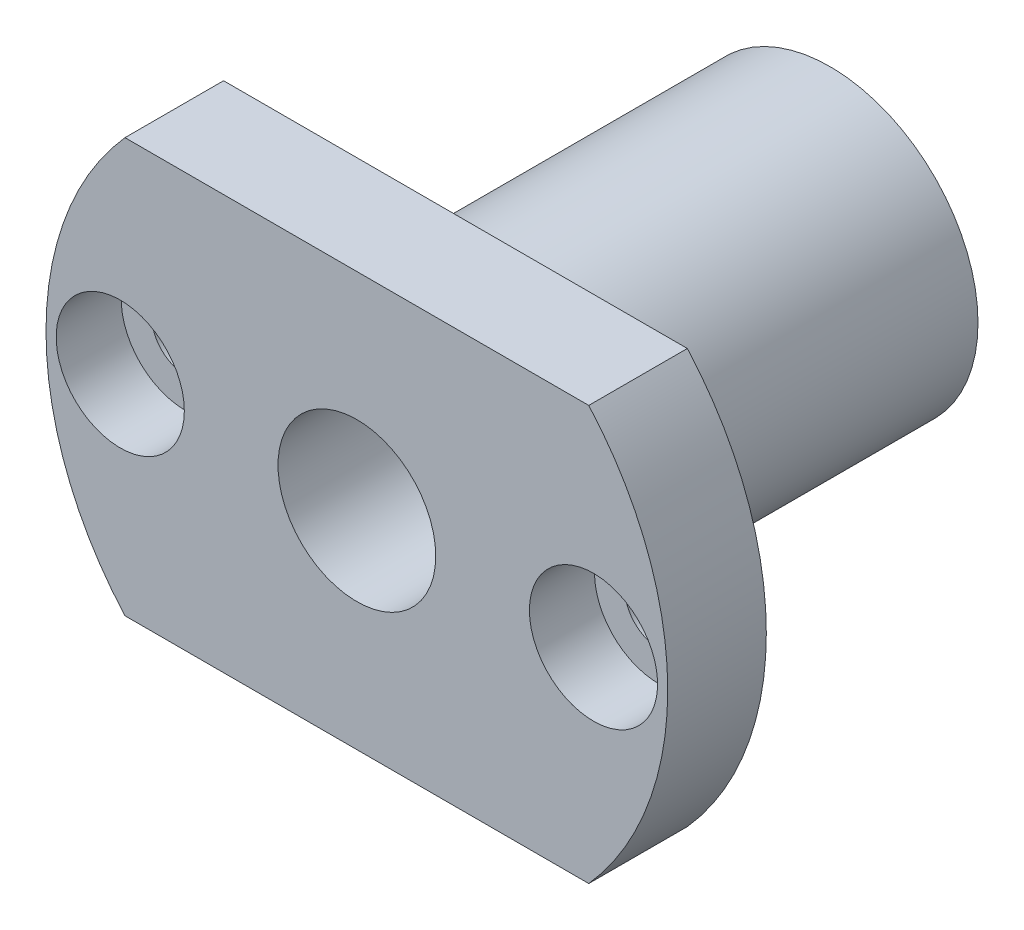
ISO-10303-21;
HEADER;
FILE_DESCRIPTION(('STEP AP214'),'2;1');
FILE_NAME('part.step','',(''),(''),'','','');
FILE_SCHEMA(('AUTOMOTIVE_DESIGN { 1 0 10303 214 1 1 1 1 }'));
ENDSEC;
DATA;
#1=APPLICATION_CONTEXT('core data for automotive mechanical design processes');
#2=APPLICATION_PROTOCOL_DEFINITION('international standard','automotive_design',2000,#1);
#3=PRODUCT_CONTEXT('',#1,'mechanical');
#4=PRODUCT('Part','Part','',(#3));
#5=PRODUCT_RELATED_PRODUCT_CATEGORY('part','',(#4));
#6=PRODUCT_DEFINITION_FORMATION('','',#4);
#7=PRODUCT_DEFINITION_CONTEXT('part definition',#1,'design');
#8=PRODUCT_DEFINITION('design','',#6,#7);
#9=PRODUCT_DEFINITION_SHAPE('','',#8);
#10=(LENGTH_UNIT() NAMED_UNIT(*) SI_UNIT(.MILLI.,.METRE.));
#11=(NAMED_UNIT(*) PLANE_ANGLE_UNIT() SI_UNIT($,.RADIAN.));
#12=(NAMED_UNIT(*) SI_UNIT($,.STERADIAN.) SOLID_ANGLE_UNIT());
#13=UNCERTAINTY_MEASURE_WITH_UNIT(LENGTH_MEASURE(1.E-05),#10,'distance_accuracy_value','');
#14=(GEOMETRIC_REPRESENTATION_CONTEXT(3) GLOBAL_UNCERTAINTY_ASSIGNED_CONTEXT((#13)) GLOBAL_UNIT_ASSIGNED_CONTEXT((#10,
#11,#12)) REPRESENTATION_CONTEXT('',''));
#15=CARTESIAN_POINT('',(0.,0.,0.));
#16=DIRECTION('',(0.,0.,1.));
#17=DIRECTION('',(1.,0.,0.));
#18=AXIS2_PLACEMENT_3D('',#15,#16,#17);
#19=CARTESIAN_POINT('',(-12.,0.,5.));
#20=DIRECTION('',(0.,0.,-1.));
#21=DIRECTION('',(-1.,0.,0.));
#22=AXIS2_PLACEMENT_3D('',#19,#20,#21);
#23=CYLINDRICAL_SURFACE('',#22,1.7);
#24=CARTESIAN_POINT('',(-12.,0.,0.));
#25=DIRECTION('',(0.,0.,1.));
#26=DIRECTION('',(1.,0.,0.));
#27=AXIS2_PLACEMENT_3D('',#24,#25,#26);
#28=CIRCLE('',#27,1.7);
#29=CARTESIAN_POINT('',(-10.3,0.,0.));
#30=VERTEX_POINT('',#29);
#31=EDGE_CURVE('E117',#30,#30,#28,.T.);
#32=ORIENTED_EDGE('',*,*,#31,.F.);
#33=EDGE_LOOP('',(#32));
#34=FACE_BOUND('',#33,.T.);
#35=CARTESIAN_POINT('',(-12.,0.,1.7));
#36=DIRECTION('',(0.,0.,1.));
#37=DIRECTION('',(1.,0.,0.));
#38=AXIS2_PLACEMENT_3D('',#35,#36,#37);
#39=CIRCLE('',#38,1.7);
#40=CARTESIAN_POINT('',(-10.3,0.,1.7));
#41=VERTEX_POINT('',#40);
#42=EDGE_CURVE('E124',#41,#41,#39,.T.);
#43=ORIENTED_EDGE('',*,*,#42,.T.);
#44=EDGE_LOOP('',(#43));
#45=FACE_BOUND('',#44,.T.);
#46=ADVANCED_FACE('F39',(#34,#45),#23,.F.);
#47=CARTESIAN_POINT('',(0.,-10.5,5.));
#48=DIRECTION('',(0.,1.,0.));
#49=DIRECTION('',(-1.,0.,0.));
#50=AXIS2_PLACEMENT_3D('',#47,#48,#49);
#51=PLANE('',#50);
#52=DIRECTION('',(1.,0.,0.));
#53=VECTOR('',#52,1.);
#54=CARTESIAN_POINT('',(0.,-10.5,0.));
#55=LINE('',#54,#53);
#56=CARTESIAN_POINT('',(-11.7600786208239,-10.5,0.));
#57=VERTEX_POINT('',#56);
#58=CARTESIAN_POINT('',(11.7600786208239,-10.5,0.));
#59=VERTEX_POINT('',#58);
#60=EDGE_CURVE('E109',#57,#59,#55,.T.);
#61=ORIENTED_EDGE('',*,*,#60,.T.);
#62=DIRECTION('',(0.,0.,-1.));
#63=VECTOR('',#62,1.);
#64=CARTESIAN_POINT('',(11.7600786208239,-10.5,5.));
#65=LINE('',#64,#63);
#66=CARTESIAN_POINT('',(11.7600786208239,-10.5,5.));
#67=VERTEX_POINT('',#66);
#68=EDGE_CURVE('E11',#67,#59,#65,.T.);
#69=ORIENTED_EDGE('',*,*,#68,.F.);
#70=DIRECTION('',(1.,0.,0.));
#71=VECTOR('',#70,1.);
#72=CARTESIAN_POINT('',(0.,-10.5,5.));
#73=LINE('',#72,#71);
#74=CARTESIAN_POINT('',(-11.7600786208239,-10.5,5.));
#75=VERTEX_POINT('',#74);
#76=EDGE_CURVE('E90',#75,#67,#73,.T.);
#77=ORIENTED_EDGE('',*,*,#76,.F.);
#78=DIRECTION('',(0.,0.,-1.));
#79=VECTOR('',#78,1.);
#80=CARTESIAN_POINT('',(-11.7600786208239,-10.5,5.));
#81=LINE('',#80,#79);
#82=EDGE_CURVE('E108',#75,#57,#81,.T.);
#83=ORIENTED_EDGE('',*,*,#82,.T.);
#84=EDGE_LOOP('',(#61,#69,#77,#83));
#85=FACE_BOUND('',#84,.T.);
#86=ADVANCED_FACE('F41',(#85),#51,.F.);
#87=CARTESIAN_POINT('',(0.,0.,5.));
#88=DIRECTION('',(0.,0.,-1.));
#89=DIRECTION('',(-1.,0.,0.));
#90=AXIS2_PLACEMENT_3D('',#87,#88,#89);
#91=CYLINDRICAL_SURFACE('',#90,15.7654511247842);
#92=CARTESIAN_POINT('',(0.,0.,0.));
#93=DIRECTION('',(0.,0.,1.));
#94=DIRECTION('',(1.,0.,0.));
#95=AXIS2_PLACEMENT_3D('',#92,#93,#94);
#96=CIRCLE('',#95,15.7654511247842);
#97=CARTESIAN_POINT('',(11.7600786208239,10.5,0.));
#98=VERTEX_POINT('',#97);
#99=EDGE_CURVE('E95',#59,#98,#96,.T.);
#100=ORIENTED_EDGE('',*,*,#99,.T.);
#101=DIRECTION('',(0.,0.,-1.));
#102=VECTOR('',#101,1.);
#103=CARTESIAN_POINT('',(11.7600786208239,10.5,5.));
#104=LINE('',#103,#102);
#105=CARTESIAN_POINT('',(11.7600786208239,10.5,5.));
#106=VERTEX_POINT('',#105);
#107=EDGE_CURVE('E49',#106,#98,#104,.T.);
#108=ORIENTED_EDGE('',*,*,#107,.F.);
#109=CARTESIAN_POINT('',(0.,0.,5.));
#110=DIRECTION('',(0.,0.,1.));
#111=DIRECTION('',(1.,0.,0.));
#112=AXIS2_PLACEMENT_3D('',#109,#110,#111);
#113=CIRCLE('',#112,15.7654511247842);
#114=EDGE_CURVE('E84',#67,#106,#113,.T.);
#115=ORIENTED_EDGE('',*,*,#114,.F.);
#116=ORIENTED_EDGE('',*,*,#68,.T.);
#117=EDGE_LOOP('',(#100,#108,#115,#116));
#118=FACE_BOUND('',#117,.T.);
#119=ADVANCED_FACE('F94',(#118),#91,.T.);
#120=CARTESIAN_POINT('',(0.,10.5,5.));
#121=DIRECTION('',(0.,1.,0.));
#122=DIRECTION('',(0.,0.,1.));
#123=AXIS2_PLACEMENT_3D('',#120,#121,#122);
#124=PLANE('',#123);
#125=DIRECTION('',(1.,0.,0.));
#126=VECTOR('',#125,1.);
#127=CARTESIAN_POINT('',(0.,10.5,0.));
#128=LINE('',#127,#126);
#129=CARTESIAN_POINT('',(-11.7600786208239,10.5,0.));
#130=VERTEX_POINT('',#129);
#131=EDGE_CURVE('E114',#130,#98,#128,.T.);
#132=ORIENTED_EDGE('',*,*,#131,.F.);
#133=DIRECTION('',(0.,0.,-1.));
#134=VECTOR('',#133,1.);
#135=CARTESIAN_POINT('',(-11.7600786208239,10.5,5.));
#136=LINE('',#135,#134);
#137=CARTESIAN_POINT('',(-11.7600786208239,10.5,5.));
#138=VERTEX_POINT('',#137);
#139=EDGE_CURVE('E74',#138,#130,#136,.T.);
#140=ORIENTED_EDGE('',*,*,#139,.F.);
#141=DIRECTION('',(1.,0.,0.));
#142=VECTOR('',#141,1.);
#143=CARTESIAN_POINT('',(0.,10.5,5.));
#144=LINE('',#143,#142);
#145=EDGE_CURVE('E88',#138,#106,#144,.T.);
#146=ORIENTED_EDGE('',*,*,#145,.T.);
#147=ORIENTED_EDGE('',*,*,#107,.T.);
#148=EDGE_LOOP('',(#132,#140,#146,#147));
#149=FACE_BOUND('',#148,.T.);
#150=ADVANCED_FACE('F100',(#149),#124,.T.);
#151=CARTESIAN_POINT('',(12.,0.,5.));
#152=DIRECTION('',(0.,0.,-1.));
#153=DIRECTION('',(-1.,0.,0.));
#154=AXIS2_PLACEMENT_3D('',#151,#152,#153);
#155=CYLINDRICAL_SURFACE('',#154,1.7);
#156=CARTESIAN_POINT('',(12.,0.,1.7));
#157=DIRECTION('',(0.,0.,-1.));
#158=DIRECTION('',(-1.,0.,0.));
#159=AXIS2_PLACEMENT_3D('',#156,#157,#158);
#160=CIRCLE('',#159,1.7);
#161=CARTESIAN_POINT('',(10.3,0.,1.7));
#162=VERTEX_POINT('',#161);
#163=EDGE_CURVE('E43',#162,#162,#160,.F.);
#164=ORIENTED_EDGE('',*,*,#163,.T.);
#165=EDGE_LOOP('',(#164));
#166=FACE_BOUND('',#165,.T.);
#167=CARTESIAN_POINT('',(12.,0.,0.));
#168=DIRECTION('',(0.,0.,1.));
#169=DIRECTION('',(1.,0.,0.));
#170=AXIS2_PLACEMENT_3D('',#167,#168,#169);
#171=CIRCLE('',#170,1.7);
#172=CARTESIAN_POINT('',(13.7,0.,0.));
#173=VERTEX_POINT('',#172);
#174=EDGE_CURVE('E120',#173,#173,#171,.F.);
#175=ORIENTED_EDGE('',*,*,#174,.T.);
#176=EDGE_LOOP('',(#175));
#177=FACE_BOUND('',#176,.T.);
#178=ADVANCED_FACE('F180',(#166,#177),#155,.F.);
#179=CARTESIAN_POINT('',(0.,0.,5.));
#180=DIRECTION('',(0.,0.,-1.));
#181=DIRECTION('',(-1.,0.,0.));
#182=AXIS2_PLACEMENT_3D('',#179,#180,#181);
#183=CYLINDRICAL_SURFACE('',#182,15.7654511247842);
#184=CARTESIAN_POINT('',(0.,0.,0.));
#185=DIRECTION('',(0.,0.,1.));
#186=DIRECTION('',(1.,0.,0.));
#187=AXIS2_PLACEMENT_3D('',#184,#185,#186);
#188=CIRCLE('',#187,15.7654511247842);
#189=EDGE_CURVE('E77',#130,#57,#188,.T.);
#190=ORIENTED_EDGE('',*,*,#189,.T.);
#191=ORIENTED_EDGE('',*,*,#82,.F.);
#192=CARTESIAN_POINT('',(0.,0.,5.));
#193=DIRECTION('',(0.,0.,1.));
#194=DIRECTION('',(1.,0.,0.));
#195=AXIS2_PLACEMENT_3D('',#192,#193,#194);
#196=CIRCLE('',#195,15.7654511247842);
#197=EDGE_CURVE('E58',#138,#75,#196,.T.);
#198=ORIENTED_EDGE('',*,*,#197,.F.);
#199=ORIENTED_EDGE('',*,*,#139,.T.);
#200=EDGE_LOOP('',(#190,#191,#198,#199));
#201=FACE_BOUND('',#200,.T.);
#202=ADVANCED_FACE('F182',(#201),#183,.T.);
#203=CARTESIAN_POINT('',(0.,0.,5.));
#204=DIRECTION('',(0.,0.,-1.));
#205=DIRECTION('',(-1.,0.,0.));
#206=AXIS2_PLACEMENT_3D('',#203,#204,#205);
#207=CYLINDRICAL_SURFACE('',#206,4.);
#208=CARTESIAN_POINT('',(0.,0.,5.));
#209=DIRECTION('',(0.,0.,1.));
#210=DIRECTION('',(1.,0.,0.));
#211=AXIS2_PLACEMENT_3D('',#208,#209,#210);
#212=CIRCLE('',#211,4.);
#213=CARTESIAN_POINT('',(4.,0.,5.));
#214=VERTEX_POINT('',#213);
#215=EDGE_CURVE('E102',#214,#214,#212,.T.);
#216=ORIENTED_EDGE('',*,*,#215,.T.);
#217=EDGE_LOOP('',(#216));
#218=FACE_BOUND('',#217,.T.);
#219=CARTESIAN_POINT('',(0.,0.,-19.));
#220=DIRECTION('',(0.,0.,1.));
#221=DIRECTION('',(1.,0.,0.));
#222=AXIS2_PLACEMENT_3D('',#219,#220,#221);
#223=CIRCLE('',#222,4.);
#224=CARTESIAN_POINT('',(4.,0.,-19.));
#225=VERTEX_POINT('',#224);
#226=EDGE_CURVE('E145',#225,#225,#223,.T.);
#227=ORIENTED_EDGE('',*,*,#226,.F.);
#228=EDGE_LOOP('',(#227));
#229=FACE_BOUND('',#228,.T.);
#230=ADVANCED_FACE('F185',(#218,#229),#207,.F.);
#231=CARTESIAN_POINT('',(0.,0.,5.));
#232=DIRECTION('',(0.,0.,1.));
#233=DIRECTION('',(1.,0.,0.));
#234=AXIS2_PLACEMENT_3D('',#231,#232,#233);
#235=PLANE('',#234);
#236=CARTESIAN_POINT('',(-12.,0.,5.));
#237=DIRECTION('',(0.,0.,1.));
#238=DIRECTION('',(1.,0.,0.));
#239=AXIS2_PLACEMENT_3D('',#236,#237,#238);
#240=CIRCLE('',#239,3.25);
#241=CARTESIAN_POINT('',(-8.75,0.,5.));
#242=VERTEX_POINT('',#241);
#243=EDGE_CURVE('E132',#242,#242,#240,.T.);
#244=ORIENTED_EDGE('',*,*,#243,.F.);
#245=EDGE_LOOP('',(#244));
#246=FACE_BOUND('',#245,.T.);
#247=CARTESIAN_POINT('',(12.,0.,5.));
#248=DIRECTION('',(0.,0.,1.));
#249=DIRECTION('',(-1.,0.,0.));
#250=AXIS2_PLACEMENT_3D('',#247,#248,#249);
#251=CIRCLE('',#250,3.25);
#252=CARTESIAN_POINT('',(8.75,0.,5.));
#253=VERTEX_POINT('',#252);
#254=EDGE_CURVE('E142',#253,#253,#251,.T.);
#255=ORIENTED_EDGE('',*,*,#254,.F.);
#256=EDGE_LOOP('',(#255));
#257=FACE_BOUND('',#256,.T.);
#258=ORIENTED_EDGE('',*,*,#76,.T.);
#259=ORIENTED_EDGE('',*,*,#114,.T.);
#260=ORIENTED_EDGE('',*,*,#145,.F.);
#261=ORIENTED_EDGE('',*,*,#197,.T.);
#262=EDGE_LOOP('',(#258,#259,#260,#261));
#263=FACE_BOUND('',#262,.T.);
#264=ORIENTED_EDGE('',*,*,#215,.F.);
#265=EDGE_LOOP('',(#264));
#266=FACE_BOUND('',#265,.T.);
#267=ADVANCED_FACE('F85',(#246,#257,#263,#266),#235,.T.);
#268=CARTESIAN_POINT('',(0.,0.,0.));
#269=DIRECTION('',(0.,0.,1.));
#270=DIRECTION('',(1.,0.,0.));
#271=AXIS2_PLACEMENT_3D('',#268,#269,#270);
#272=PLANE('',#271);
#273=CARTESIAN_POINT('',(0.,0.,0.));
#274=DIRECTION('',(0.,0.,1.));
#275=DIRECTION('',(1.,0.,0.));
#276=AXIS2_PLACEMENT_3D('',#273,#274,#275);
#277=CIRCLE('',#276,7.5);
#278=CARTESIAN_POINT('',(7.5,0.,0.));
#279=VERTEX_POINT('',#278);
#280=EDGE_CURVE('E130',#279,#279,#277,.T.);
#281=ORIENTED_EDGE('',*,*,#280,.T.);
#282=EDGE_LOOP('',(#281));
#283=FACE_BOUND('',#282,.T.);
#284=ORIENTED_EDGE('',*,*,#60,.F.);
#285=ORIENTED_EDGE('',*,*,#189,.F.);
#286=ORIENTED_EDGE('',*,*,#131,.T.);
#287=ORIENTED_EDGE('',*,*,#99,.F.);
#288=EDGE_LOOP('',(#284,#285,#286,#287));
#289=FACE_BOUND('',#288,.T.);
#290=ORIENTED_EDGE('',*,*,#31,.T.);
#291=EDGE_LOOP('',(#290));
#292=FACE_BOUND('',#291,.T.);
#293=ORIENTED_EDGE('',*,*,#174,.F.);
#294=EDGE_LOOP('',(#293));
#295=FACE_BOUND('',#294,.T.);
#296=ADVANCED_FACE('F153',(#283,#289,#292,#295),#272,.F.);
#297=CARTESIAN_POINT('',(0.,0.,-19.));
#298=DIRECTION('',(0.,0.,1.));
#299=DIRECTION('',(1.,0.,0.));
#300=AXIS2_PLACEMENT_3D('',#297,#298,#299);
#301=CYLINDRICAL_SURFACE('',#300,7.5);
#302=CARTESIAN_POINT('',(0.,0.,-19.));
#303=DIRECTION('',(0.,0.,1.));
#304=DIRECTION('',(1.,0.,0.));
#305=AXIS2_PLACEMENT_3D('',#302,#303,#304);
#306=CIRCLE('',#305,7.5);
#307=CARTESIAN_POINT('',(7.5,0.,-19.));
#308=VERTEX_POINT('',#307);
#309=EDGE_CURVE('E112',#308,#308,#306,.T.);
#310=ORIENTED_EDGE('',*,*,#309,.T.);
#311=EDGE_LOOP('',(#310));
#312=FACE_BOUND('',#311,.T.);
#313=ORIENTED_EDGE('',*,*,#280,.F.);
#314=EDGE_LOOP('',(#313));
#315=FACE_BOUND('',#314,.T.);
#316=ADVANCED_FACE('F156',(#312,#315),#301,.T.);
#317=CARTESIAN_POINT('',(0.,0.,-19.));
#318=DIRECTION('',(0.,0.,1.));
#319=DIRECTION('',(1.,0.,0.));
#320=AXIS2_PLACEMENT_3D('',#317,#318,#319);
#321=PLANE('',#320);
#322=ORIENTED_EDGE('',*,*,#226,.T.);
#323=EDGE_LOOP('',(#322));
#324=FACE_BOUND('',#323,.T.);
#325=ORIENTED_EDGE('',*,*,#309,.F.);
#326=EDGE_LOOP('',(#325));
#327=FACE_BOUND('',#326,.T.);
#328=ADVANCED_FACE('F158',(#324,#327),#321,.F.);
#329=CARTESIAN_POINT('',(12.,0.,1.7));
#330=DIRECTION('',(0.,0.,-1.));
#331=DIRECTION('',(-1.,0.,0.));
#332=AXIS2_PLACEMENT_3D('',#329,#330,#331);
#333=PLANE('',#332);
#334=CARTESIAN_POINT('',(12.,0.,1.7));
#335=DIRECTION('',(0.,0.,1.));
#336=DIRECTION('',(-1.,0.,0.));
#337=AXIS2_PLACEMENT_3D('',#334,#335,#336);
#338=CIRCLE('',#337,3.25);
#339=CARTESIAN_POINT('',(8.75,0.,1.7));
#340=VERTEX_POINT('',#339);
#341=EDGE_CURVE('E137',#340,#340,#338,.T.);
#342=ORIENTED_EDGE('',*,*,#341,.T.);
#343=EDGE_LOOP('',(#342));
#344=FACE_BOUND('',#343,.T.);
#345=ORIENTED_EDGE('',*,*,#163,.F.);
#346=EDGE_LOOP('',(#345));
#347=FACE_BOUND('',#346,.T.);
#348=ADVANCED_FACE('F165',(#344,#347),#333,.F.);
#349=CARTESIAN_POINT('',(12.,0.,1.7));
#350=DIRECTION('',(0.,0.,1.));
#351=DIRECTION('',(1.,0.,0.));
#352=AXIS2_PLACEMENT_3D('',#349,#350,#351);
#353=CYLINDRICAL_SURFACE('',#352,3.25);
#354=ORIENTED_EDGE('',*,*,#341,.F.);
#355=EDGE_LOOP('',(#354));
#356=FACE_BOUND('',#355,.T.);
#357=ORIENTED_EDGE('',*,*,#254,.T.);
#358=EDGE_LOOP('',(#357));
#359=FACE_BOUND('',#358,.T.);
#360=ADVANCED_FACE('F249',(#356,#359),#353,.F.);
#361=CARTESIAN_POINT('',(-12.,0.,1.7));
#362=DIRECTION('',(0.,0.,1.));
#363=DIRECTION('',(1.,0.,0.));
#364=AXIS2_PLACEMENT_3D('',#361,#362,#363);
#365=CYLINDRICAL_SURFACE('',#364,3.25);
#366=CARTESIAN_POINT('',(-12.,0.,1.7));
#367=DIRECTION('',(0.,0.,1.));
#368=DIRECTION('',(1.,0.,0.));
#369=AXIS2_PLACEMENT_3D('',#366,#367,#368);
#370=CIRCLE('',#369,3.25);
#371=CARTESIAN_POINT('',(-8.75,0.,1.7));
#372=VERTEX_POINT('',#371);
#373=EDGE_CURVE('E126',#372,#372,#370,.T.);
#374=ORIENTED_EDGE('',*,*,#373,.F.);
#375=EDGE_LOOP('',(#374));
#376=FACE_BOUND('',#375,.T.);
#377=ORIENTED_EDGE('',*,*,#243,.T.);
#378=EDGE_LOOP('',(#377));
#379=FACE_BOUND('',#378,.T.);
#380=ADVANCED_FACE('F258',(#376,#379),#365,.F.);
#381=CARTESIAN_POINT('',(-12.,0.,1.7));
#382=DIRECTION('',(0.,0.,1.));
#383=DIRECTION('',(1.,0.,0.));
#384=AXIS2_PLACEMENT_3D('',#381,#382,#383);
#385=PLANE('',#384);
#386=ORIENTED_EDGE('',*,*,#42,.F.);
#387=EDGE_LOOP('',(#386));
#388=FACE_BOUND('',#387,.T.);
#389=ORIENTED_EDGE('',*,*,#373,.T.);
#390=EDGE_LOOP('',(#389));
#391=FACE_BOUND('',#390,.T.);
#392=ADVANCED_FACE('F267',(#388,#391),#385,.T.);
#393=CLOSED_SHELL('',(#46,#86,#119,#150,#178,#202,#230,#267,#296,#316,#328,#348,#360,#380,#392));
#394=MANIFOLD_SOLID_BREP('B2',#393);
#395=ADVANCED_BREP_SHAPE_REPRESENTATION('',(#18,#394),#14);
#396=SHAPE_DEFINITION_REPRESENTATION(#9,#395);
ENDSEC;
END-ISO-10303-21;
